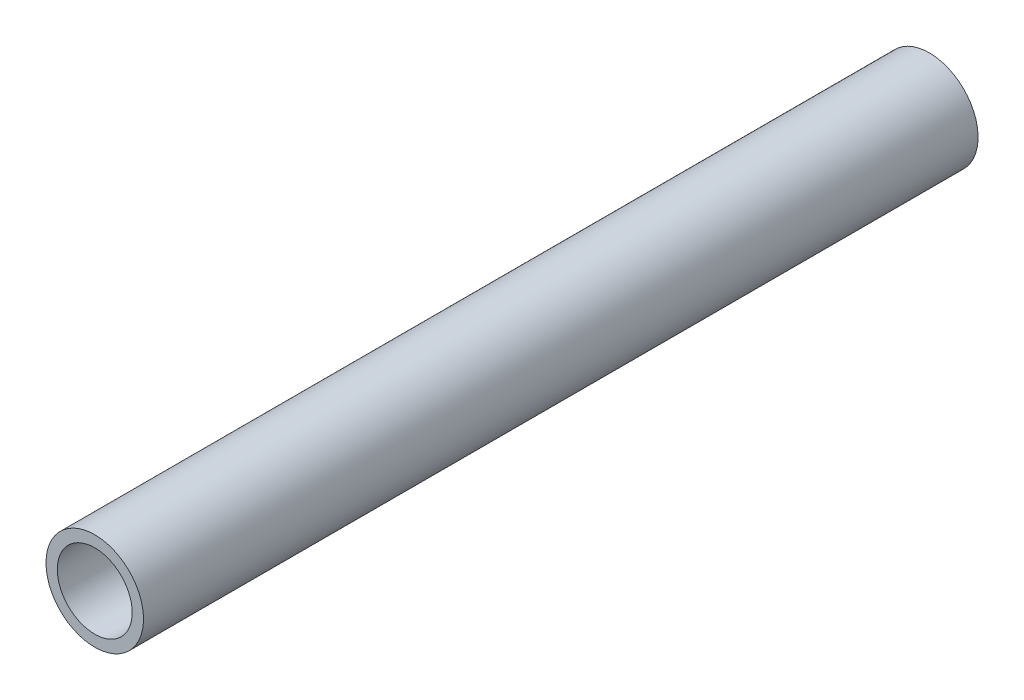
ISO-10303-21;
HEADER;
FILE_DESCRIPTION(('STEP AP214'),'2;1');
FILE_NAME('part.step','',(''),(''),'','','');
FILE_SCHEMA(('AUTOMOTIVE_DESIGN { 1 0 10303 214 1 1 1 1 }'));
ENDSEC;
DATA;
#1=APPLICATION_CONTEXT('core data for automotive mechanical design processes');
#2=APPLICATION_PROTOCOL_DEFINITION('international standard','automotive_design',2000,#1);
#3=PRODUCT_CONTEXT('',#1,'mechanical');
#4=PRODUCT('Part','Part','',(#3));
#5=PRODUCT_RELATED_PRODUCT_CATEGORY('part','',(#4));
#6=PRODUCT_DEFINITION_FORMATION('','',#4);
#7=PRODUCT_DEFINITION_CONTEXT('part definition',#1,'design');
#8=PRODUCT_DEFINITION('design','',#6,#7);
#9=PRODUCT_DEFINITION_SHAPE('','',#8);
#10=(LENGTH_UNIT() NAMED_UNIT(*) SI_UNIT(.MILLI.,.METRE.));
#11=(NAMED_UNIT(*) PLANE_ANGLE_UNIT() SI_UNIT($,.RADIAN.));
#12=(NAMED_UNIT(*) SI_UNIT($,.STERADIAN.) SOLID_ANGLE_UNIT());
#13=UNCERTAINTY_MEASURE_WITH_UNIT(LENGTH_MEASURE(1.E-05),#10,'distance_accuracy_value','');
#14=(GEOMETRIC_REPRESENTATION_CONTEXT(3) GLOBAL_UNCERTAINTY_ASSIGNED_CONTEXT((#13)) GLOBAL_UNIT_ASSIGNED_CONTEXT((#10,
#11,#12)) REPRESENTATION_CONTEXT('',''));
#15=CARTESIAN_POINT('',(0.,0.,0.));
#16=DIRECTION('',(0.,0.,1.));
#17=DIRECTION('',(1.,0.,0.));
#18=AXIS2_PLACEMENT_3D('',#15,#16,#17);
#19=CARTESIAN_POINT('',(0.,0.,54.356));
#20=DIRECTION('',(0.,0.,-1.));
#21=DIRECTION('',(-1.,0.,0.));
#22=AXIS2_PLACEMENT_3D('',#19,#20,#21);
#23=CYLINDRICAL_SURFACE('',#22,2.4384);
#24=CARTESIAN_POINT('',(0.,0.,0.));
#25=DIRECTION('',(0.,0.,-1.));
#26=DIRECTION('',(-1.,0.,0.));
#27=AXIS2_PLACEMENT_3D('',#24,#25,#26);
#28=CIRCLE('',#27,2.4384);
#29=CARTESIAN_POINT('',(-2.4384,0.,0.));
#30=VERTEX_POINT('',#29);
#31=EDGE_CURVE('E26',#30,#30,#28,.T.);
#32=ORIENTED_EDGE('',*,*,#31,.T.);
#33=EDGE_LOOP('',(#32));
#34=FACE_BOUND('',#33,.T.);
#35=CARTESIAN_POINT('',(0.,0.,54.356));
#36=DIRECTION('',(0.,0.,-1.));
#37=DIRECTION('',(-1.,0.,0.));
#38=AXIS2_PLACEMENT_3D('',#35,#36,#37);
#39=CIRCLE('',#38,2.4384);
#40=CARTESIAN_POINT('',(-2.4384,0.,54.356));
#41=VERTEX_POINT('',#40);
#42=EDGE_CURVE('E17',#41,#41,#39,.T.);
#43=ORIENTED_EDGE('',*,*,#42,.F.);
#44=EDGE_LOOP('',(#43));
#45=FACE_BOUND('',#44,.T.);
#46=ADVANCED_FACE('F14',(#34,#45),#23,.F.);
#47=CARTESIAN_POINT('',(0.,0.,54.356));
#48=DIRECTION('',(0.,0.,1.));
#49=DIRECTION('',(1.,0.,0.));
#50=AXIS2_PLACEMENT_3D('',#47,#48,#49);
#51=PLANE('',#50);
#52=ORIENTED_EDGE('',*,*,#42,.T.);
#53=EDGE_LOOP('',(#52));
#54=FACE_BOUND('',#53,.T.);
#55=CARTESIAN_POINT('',(0.,0.,54.356));
#56=DIRECTION('',(0.,0.,-1.));
#57=DIRECTION('',(-1.,0.,0.));
#58=AXIS2_PLACEMENT_3D('',#55,#56,#57);
#59=CIRCLE('',#58,3.175);
#60=CARTESIAN_POINT('',(-3.175,0.,54.356));
#61=VERTEX_POINT('',#60);
#62=EDGE_CURVE('E21',#61,#61,#59,.T.);
#63=ORIENTED_EDGE('',*,*,#62,.F.);
#64=EDGE_LOOP('',(#63));
#65=FACE_BOUND('',#64,.T.);
#66=ADVANCED_FACE('F34',(#54,#65),#51,.T.);
#67=CARTESIAN_POINT('',(0.,0.,0.));
#68=DIRECTION('',(0.,0.,1.));
#69=DIRECTION('',(1.,0.,0.));
#70=AXIS2_PLACEMENT_3D('',#67,#68,#69);
#71=PLANE('',#70);
#72=ORIENTED_EDGE('',*,*,#31,.F.);
#73=EDGE_LOOP('',(#72));
#74=FACE_BOUND('',#73,.T.);
#75=CARTESIAN_POINT('',(0.,0.,0.));
#76=DIRECTION('',(0.,0.,-1.));
#77=DIRECTION('',(-1.,0.,0.));
#78=AXIS2_PLACEMENT_3D('',#75,#76,#77);
#79=CIRCLE('',#78,3.175);
#80=CARTESIAN_POINT('',(-3.175,0.,0.));
#81=VERTEX_POINT('',#80);
#82=EDGE_CURVE('E10',#81,#81,#79,.F.);
#83=ORIENTED_EDGE('',*,*,#82,.F.);
#84=EDGE_LOOP('',(#83));
#85=FACE_BOUND('',#84,.T.);
#86=ADVANCED_FACE('F42',(#74,#85),#71,.F.);
#87=CARTESIAN_POINT('',(0.,0.,54.356));
#88=DIRECTION('',(0.,0.,-1.));
#89=DIRECTION('',(-1.,0.,0.));
#90=AXIS2_PLACEMENT_3D('',#87,#88,#89);
#91=CYLINDRICAL_SURFACE('',#90,3.175);
#92=ORIENTED_EDGE('',*,*,#82,.T.);
#93=EDGE_LOOP('',(#92));
#94=FACE_BOUND('',#93,.T.);
#95=ORIENTED_EDGE('',*,*,#62,.T.);
#96=EDGE_LOOP('',(#95));
#97=FACE_BOUND('',#96,.T.);
#98=ADVANCED_FACE('F43',(#94,#97),#91,.T.);
#99=CLOSED_SHELL('',(#46,#66,#86,#98));
#100=MANIFOLD_SOLID_BREP('B1',#99);
#101=ADVANCED_BREP_SHAPE_REPRESENTATION('',(#18,#100),#14);
#102=SHAPE_DEFINITION_REPRESENTATION(#9,#101);
ENDSEC;
END-ISO-10303-21;
